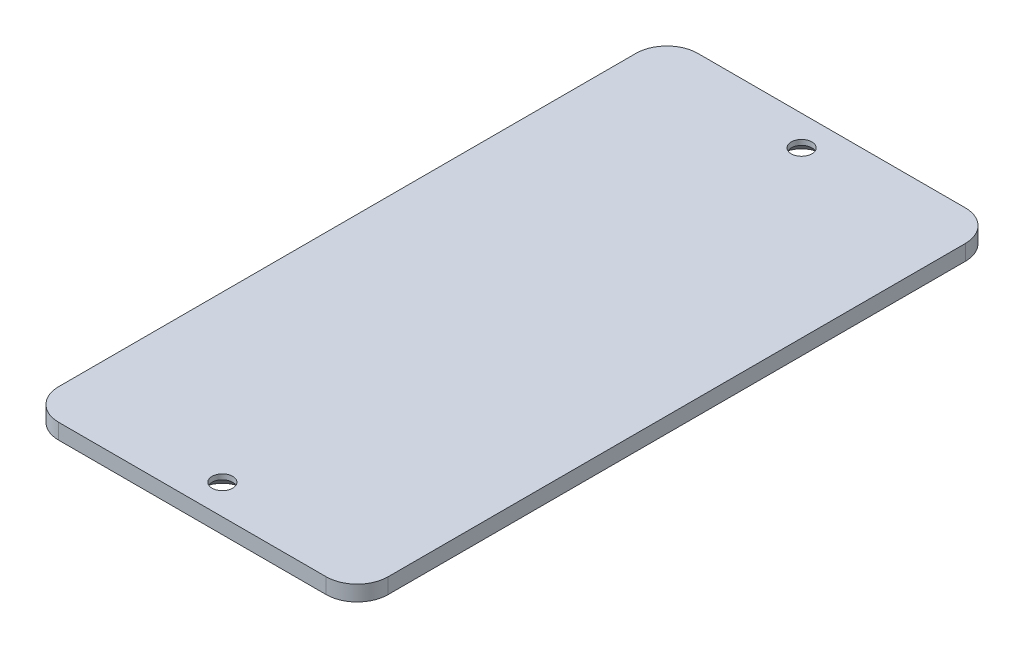
ISO-10303-21;
HEADER;
FILE_DESCRIPTION(('STEP AP214'),'2;1');
FILE_NAME('part.step','',(''),(''),'','','');
FILE_SCHEMA(('AUTOMOTIVE_DESIGN { 1 0 10303 214 1 1 1 1 }'));
ENDSEC;
DATA;
#1=APPLICATION_CONTEXT('core data for automotive mechanical design processes');
#2=APPLICATION_PROTOCOL_DEFINITION('international standard','automotive_design',2000,#1);
#3=PRODUCT_CONTEXT('',#1,'mechanical');
#4=PRODUCT('Part','Part','',(#3));
#5=PRODUCT_RELATED_PRODUCT_CATEGORY('part','',(#4));
#6=PRODUCT_DEFINITION_FORMATION('','',#4);
#7=PRODUCT_DEFINITION_CONTEXT('part definition',#1,'design');
#8=PRODUCT_DEFINITION('design','',#6,#7);
#9=PRODUCT_DEFINITION_SHAPE('','',#8);
#10=(LENGTH_UNIT() NAMED_UNIT(*) SI_UNIT(.MILLI.,.METRE.));
#11=(NAMED_UNIT(*) PLANE_ANGLE_UNIT() SI_UNIT($,.RADIAN.));
#12=(NAMED_UNIT(*) SI_UNIT($,.STERADIAN.) SOLID_ANGLE_UNIT());
#13=UNCERTAINTY_MEASURE_WITH_UNIT(LENGTH_MEASURE(1.E-05),#10,'distance_accuracy_value','');
#14=(GEOMETRIC_REPRESENTATION_CONTEXT(3) GLOBAL_UNCERTAINTY_ASSIGNED_CONTEXT((#13)) GLOBAL_UNIT_ASSIGNED_CONTEXT((#10,
#11,#12)) REPRESENTATION_CONTEXT('',''));
#15=CARTESIAN_POINT('',(0.,0.,0.));
#16=DIRECTION('',(0.,0.,1.));
#17=DIRECTION('',(1.,0.,0.));
#18=AXIS2_PLACEMENT_3D('',#15,#16,#17);
#19=CARTESIAN_POINT('',(0.,0.,-56.1));
#20=DIRECTION('',(0.,1.,0.));
#21=DIRECTION('',(0.,0.,1.));
#22=AXIS2_PLACEMENT_3D('',#19,#20,#21);
#23=CYLINDRICAL_SURFACE('',#22,2.);
#24=CARTESIAN_POINT('',(0.,3.,-56.1));
#25=DIRECTION('',(0.,-1.,0.));
#26=DIRECTION('',(0.,0.,-1.));
#27=AXIS2_PLACEMENT_3D('',#24,#25,#26);
#28=CIRCLE('',#27,2.);
#29=CARTESIAN_POINT('',(0.,3.,-58.1));
#30=VERTEX_POINT('',#29);
#31=EDGE_CURVE('E225',#30,#30,#28,.T.);
#32=ORIENTED_EDGE('',*,*,#31,.F.);
#33=EDGE_LOOP('',(#32));
#34=FACE_BOUND('',#33,.T.);
#35=CARTESIAN_POINT('',(0.,2.00000000000002,-56.1));
#36=DIRECTION('',(0.,-1.,0.));
#37=DIRECTION('',(0.,0.,-1.));
#38=AXIS2_PLACEMENT_3D('',#35,#36,#37);
#39=CIRCLE('',#38,1.99999999999999);
#40=CARTESIAN_POINT('',(0.,2.00000000000002,-58.1));
#41=VERTEX_POINT('',#40);
#42=EDGE_CURVE('E229',#41,#41,#39,.T.);
#43=ORIENTED_EDGE('',*,*,#42,.T.);
#44=EDGE_LOOP('',(#43));
#45=FACE_BOUND('',#44,.T.);
#46=ADVANCED_FACE('F46',(#34,#45),#23,.F.);
#47=CARTESIAN_POINT('',(0.,0.,0.));
#48=DIRECTION('',(0.,1.,0.));
#49=DIRECTION('',(0.,0.,1.));
#50=AXIS2_PLACEMENT_3D('',#47,#48,#49);
#51=PLANE('',#50);
#52=CARTESIAN_POINT('',(0.,0.,-56.1));
#53=DIRECTION('',(0.,-1.,0.));
#54=DIRECTION('',(0.,0.,-1.));
#55=AXIS2_PLACEMENT_3D('',#52,#53,#54);
#56=CIRCLE('',#55,4.);
#57=CARTESIAN_POINT('',(0.,0.,-60.1));
#58=VERTEX_POINT('',#57);
#59=EDGE_CURVE('E233',#58,#58,#56,.T.);
#60=ORIENTED_EDGE('',*,*,#59,.F.);
#61=EDGE_LOOP('',(#60));
#62=FACE_BOUND('',#61,.T.);
#63=DIRECTION('',(-1.,0.,0.));
#64=VECTOR('',#63,1.);
#65=CARTESIAN_POINT('',(-31.9,0.,-61.9));
#66=LINE('',#65,#64);
#67=CARTESIAN_POINT('',(25.9,0.,-61.9));
#68=VERTEX_POINT('',#67);
#69=CARTESIAN_POINT('',(-25.9,0.,-61.9));
#70=VERTEX_POINT('',#69);
#71=EDGE_CURVE('E131',#68,#70,#66,.T.);
#72=ORIENTED_EDGE('',*,*,#71,.F.);
#73=CARTESIAN_POINT('',(25.9,0.,-55.9));
#74=DIRECTION('',(0.,1.,0.));
#75=DIRECTION('',(0.,0.,1.));
#76=AXIS2_PLACEMENT_3D('',#73,#74,#75);
#77=CIRCLE('',#76,6.);
#78=CARTESIAN_POINT('',(31.9,0.,-55.9));
#79=VERTEX_POINT('',#78);
#80=EDGE_CURVE('E113',#68,#79,#77,.F.);
#81=ORIENTED_EDGE('',*,*,#80,.T.);
#82=DIRECTION('',(0.,0.,-1.));
#83=VECTOR('',#82,1.);
#84=CARTESIAN_POINT('',(31.9,0.,-61.9));
#85=LINE('',#84,#83);
#86=CARTESIAN_POINT('',(31.9,0.,55.9));
#87=VERTEX_POINT('',#86);
#88=EDGE_CURVE('E144',#87,#79,#85,.T.);
#89=ORIENTED_EDGE('',*,*,#88,.F.);
#90=CARTESIAN_POINT('',(25.9,0.,55.9));
#91=DIRECTION('',(0.,1.,0.));
#92=DIRECTION('',(0.,0.,1.));
#93=AXIS2_PLACEMENT_3D('',#90,#91,#92);
#94=CIRCLE('',#93,6.);
#95=CARTESIAN_POINT('',(25.9,0.,61.9));
#96=VERTEX_POINT('',#95);
#97=EDGE_CURVE('E125',#87,#96,#94,.F.);
#98=ORIENTED_EDGE('',*,*,#97,.T.);
#99=DIRECTION('',(1.,0.,0.));
#100=VECTOR('',#99,1.);
#101=CARTESIAN_POINT('',(-31.9,0.,61.9));
#102=LINE('',#101,#100);
#103=CARTESIAN_POINT('',(-25.9,0.,61.9));
#104=VERTEX_POINT('',#103);
#105=EDGE_CURVE('E149',#104,#96,#102,.T.);
#106=ORIENTED_EDGE('',*,*,#105,.F.);
#107=CARTESIAN_POINT('',(-25.9,0.,55.9));
#108=DIRECTION('',(0.,1.,0.));
#109=DIRECTION('',(0.,0.,1.));
#110=AXIS2_PLACEMENT_3D('',#107,#108,#109);
#111=CIRCLE('',#110,6.);
#112=CARTESIAN_POINT('',(-31.9,0.,55.9));
#113=VERTEX_POINT('',#112);
#114=EDGE_CURVE('E163',#104,#113,#111,.F.);
#115=ORIENTED_EDGE('',*,*,#114,.T.);
#116=DIRECTION('',(0.,0.,1.));
#117=VECTOR('',#116,1.);
#118=CARTESIAN_POINT('',(-31.9,0.,-61.9));
#119=LINE('',#118,#117);
#120=CARTESIAN_POINT('',(-31.9,0.,-55.9));
#121=VERTEX_POINT('',#120);
#122=EDGE_CURVE('E143',#121,#113,#119,.T.);
#123=ORIENTED_EDGE('',*,*,#122,.F.);
#124=CARTESIAN_POINT('',(-25.9,0.,-55.9));
#125=DIRECTION('',(0.,1.,0.));
#126=DIRECTION('',(0.,0.,1.));
#127=AXIS2_PLACEMENT_3D('',#124,#125,#126);
#128=CIRCLE('',#127,6.);
#129=EDGE_CURVE('E136',#121,#70,#128,.F.);
#130=ORIENTED_EDGE('',*,*,#129,.T.);
#131=EDGE_LOOP('',(#72,#81,#89,#98,#106,#115,#123,#130));
#132=FACE_BOUND('',#131,.T.);
#133=CARTESIAN_POINT('',(0.,0.,56.1));
#134=DIRECTION('',(0.,-1.,0.));
#135=DIRECTION('',(0.,0.,-1.));
#136=AXIS2_PLACEMENT_3D('',#133,#134,#135);
#137=CIRCLE('',#136,4.);
#138=CARTESIAN_POINT('',(0.,0.,52.1));
#139=VERTEX_POINT('',#138);
#140=EDGE_CURVE('E221',#139,#139,#137,.T.);
#141=ORIENTED_EDGE('',*,*,#140,.F.);
#142=EDGE_LOOP('',(#141));
#143=FACE_BOUND('',#142,.T.);
#144=ADVANCED_FACE('F139',(#62,#132,#143),#51,.F.);
#145=CARTESIAN_POINT('',(31.9,3.,-61.9));
#146=DIRECTION('',(-1.,0.,0.));
#147=DIRECTION('',(0.,0.,1.));
#148=AXIS2_PLACEMENT_3D('',#145,#146,#147);
#149=PLANE('',#148);
#150=ORIENTED_EDGE('',*,*,#88,.T.);
#151=DIRECTION('',(0.,-1.,0.));
#152=VECTOR('',#151,1.);
#153=CARTESIAN_POINT('',(31.9,3.,-55.9));
#154=LINE('',#153,#152);
#155=CARTESIAN_POINT('',(31.9,3.,-55.9));
#156=VERTEX_POINT('',#155);
#157=EDGE_CURVE('E118',#79,#156,#154,.F.);
#158=ORIENTED_EDGE('',*,*,#157,.T.);
#159=DIRECTION('',(0.,0.,-1.));
#160=VECTOR('',#159,1.);
#161=CARTESIAN_POINT('',(31.9,3.,-61.9));
#162=LINE('',#161,#160);
#163=CARTESIAN_POINT('',(31.9,3.,55.9));
#164=VERTEX_POINT('',#163);
#165=EDGE_CURVE('E157',#164,#156,#162,.T.);
#166=ORIENTED_EDGE('',*,*,#165,.F.);
#167=DIRECTION('',(0.,-1.,0.));
#168=VECTOR('',#167,1.);
#169=CARTESIAN_POINT('',(31.9,3.,55.9));
#170=LINE('',#169,#168);
#171=EDGE_CURVE('E124',#164,#87,#170,.T.);
#172=ORIENTED_EDGE('',*,*,#171,.T.);
#173=EDGE_LOOP('',(#150,#158,#166,#172));
#174=FACE_BOUND('',#173,.T.);
#175=ADVANCED_FACE('F241',(#174),#149,.F.);
#176=CARTESIAN_POINT('',(-31.9,3.,-61.9));
#177=DIRECTION('',(0.,0.,1.));
#178=DIRECTION('',(1.,0.,0.));
#179=AXIS2_PLACEMENT_3D('',#176,#177,#178);
#180=PLANE('',#179);
#181=DIRECTION('',(-1.,0.,0.));
#182=VECTOR('',#181,1.);
#183=CARTESIAN_POINT('',(-31.9,3.,-61.9));
#184=LINE('',#183,#182);
#185=CARTESIAN_POINT('',(25.9,3.,-61.9));
#186=VERTEX_POINT('',#185);
#187=CARTESIAN_POINT('',(-25.9,3.,-61.9));
#188=VERTEX_POINT('',#187);
#189=EDGE_CURVE('E134',#186,#188,#184,.T.);
#190=ORIENTED_EDGE('',*,*,#189,.F.);
#191=DIRECTION('',(0.,-1.,0.));
#192=VECTOR('',#191,1.);
#193=CARTESIAN_POINT('',(25.9,3.,-61.9));
#194=LINE('',#193,#192);
#195=EDGE_CURVE('E117',#186,#68,#194,.T.);
#196=ORIENTED_EDGE('',*,*,#195,.T.);
#197=ORIENTED_EDGE('',*,*,#71,.T.);
#198=DIRECTION('',(0.,-1.,0.));
#199=VECTOR('',#198,1.);
#200=CARTESIAN_POINT('',(-25.9,3.,-61.9));
#201=LINE('',#200,#199);
#202=EDGE_CURVE('E137',#70,#188,#201,.F.);
#203=ORIENTED_EDGE('',*,*,#202,.T.);
#204=EDGE_LOOP('',(#190,#196,#197,#203));
#205=FACE_BOUND('',#204,.T.);
#206=ADVANCED_FACE('F130',(#205),#180,.F.);
#207=CARTESIAN_POINT('',(-31.9,3.,-61.9));
#208=DIRECTION('',(1.,0.,0.));
#209=DIRECTION('',(0.,0.,-1.));
#210=AXIS2_PLACEMENT_3D('',#207,#208,#209);
#211=PLANE('',#210);
#212=ORIENTED_EDGE('',*,*,#122,.T.);
#213=DIRECTION('',(0.,-1.,0.));
#214=VECTOR('',#213,1.);
#215=CARTESIAN_POINT('',(-31.9,3.,55.9));
#216=LINE('',#215,#214);
#217=CARTESIAN_POINT('',(-31.9,3.,55.9));
#218=VERTEX_POINT('',#217);
#219=EDGE_CURVE('E11',#113,#218,#216,.F.);
#220=ORIENTED_EDGE('',*,*,#219,.T.);
#221=DIRECTION('',(0.,0.,1.));
#222=VECTOR('',#221,1.);
#223=CARTESIAN_POINT('',(-31.9,3.,-61.9));
#224=LINE('',#223,#222);
#225=CARTESIAN_POINT('',(-31.9,3.,-55.9));
#226=VERTEX_POINT('',#225);
#227=EDGE_CURVE('E196',#226,#218,#224,.T.);
#228=ORIENTED_EDGE('',*,*,#227,.F.);
#229=DIRECTION('',(0.,-1.,0.));
#230=VECTOR('',#229,1.);
#231=CARTESIAN_POINT('',(-31.9,3.,-55.9));
#232=LINE('',#231,#230);
#233=EDGE_CURVE('E55',#226,#121,#232,.T.);
#234=ORIENTED_EDGE('',*,*,#233,.T.);
#235=EDGE_LOOP('',(#212,#220,#228,#234));
#236=FACE_BOUND('',#235,.T.);
#237=ADVANCED_FACE('F194',(#236),#211,.F.);
#238=CARTESIAN_POINT('',(-31.9,3.,61.9));
#239=DIRECTION('',(0.,0.,-1.));
#240=DIRECTION('',(-1.,0.,0.));
#241=AXIS2_PLACEMENT_3D('',#238,#239,#240);
#242=PLANE('',#241);
#243=ORIENTED_EDGE('',*,*,#105,.T.);
#244=DIRECTION('',(0.,-1.,0.));
#245=VECTOR('',#244,1.);
#246=CARTESIAN_POINT('',(25.9,3.,61.9));
#247=LINE('',#246,#245);
#248=CARTESIAN_POINT('',(25.9,3.,61.9));
#249=VERTEX_POINT('',#248);
#250=EDGE_CURVE('E62',#96,#249,#247,.F.);
#251=ORIENTED_EDGE('',*,*,#250,.T.);
#252=DIRECTION('',(1.,0.,0.));
#253=VECTOR('',#252,1.);
#254=CARTESIAN_POINT('',(-31.9,3.,61.9));
#255=LINE('',#254,#253);
#256=CARTESIAN_POINT('',(-25.9,3.,61.9));
#257=VERTEX_POINT('',#256);
#258=EDGE_CURVE('E159',#257,#249,#255,.T.);
#259=ORIENTED_EDGE('',*,*,#258,.F.);
#260=DIRECTION('',(0.,-1.,0.));
#261=VECTOR('',#260,1.);
#262=CARTESIAN_POINT('',(-25.9,3.,61.9));
#263=LINE('',#262,#261);
#264=EDGE_CURVE('E184',#257,#104,#263,.T.);
#265=ORIENTED_EDGE('',*,*,#264,.T.);
#266=EDGE_LOOP('',(#243,#251,#259,#265));
#267=FACE_BOUND('',#266,.T.);
#268=ADVANCED_FACE('F203',(#267),#242,.F.);
#269=CARTESIAN_POINT('',(0.,3.,0.));
#270=DIRECTION('',(0.,1.,0.));
#271=DIRECTION('',(0.,0.,1.));
#272=AXIS2_PLACEMENT_3D('',#269,#270,#271);
#273=PLANE('',#272);
#274=ORIENTED_EDGE('',*,*,#31,.T.);
#275=EDGE_LOOP('',(#274));
#276=FACE_BOUND('',#275,.T.);
#277=CARTESIAN_POINT('',(0.,3.,56.1));
#278=DIRECTION('',(0.,1.,0.));
#279=DIRECTION('',(0.,0.,1.));
#280=AXIS2_PLACEMENT_3D('',#277,#278,#279);
#281=CIRCLE('',#280,2.);
#282=CARTESIAN_POINT('',(0.,3.,58.1));
#283=VERTEX_POINT('',#282);
#284=EDGE_CURVE('E151',#283,#283,#281,.T.);
#285=ORIENTED_EDGE('',*,*,#284,.F.);
#286=EDGE_LOOP('',(#285));
#287=FACE_BOUND('',#286,.T.);
#288=ORIENTED_EDGE('',*,*,#165,.T.);
#289=CARTESIAN_POINT('',(25.9,3.,-55.9));
#290=DIRECTION('',(0.,1.,0.));
#291=DIRECTION('',(0.,0.,1.));
#292=AXIS2_PLACEMENT_3D('',#289,#290,#291);
#293=CIRCLE('',#292,6.);
#294=EDGE_CURVE('E181',#156,#186,#293,.T.);
#295=ORIENTED_EDGE('',*,*,#294,.T.);
#296=ORIENTED_EDGE('',*,*,#189,.T.);
#297=CARTESIAN_POINT('',(-25.9,3.,-55.9));
#298=DIRECTION('',(0.,1.,0.));
#299=DIRECTION('',(0.,0.,1.));
#300=AXIS2_PLACEMENT_3D('',#297,#298,#299);
#301=CIRCLE('',#300,6.);
#302=EDGE_CURVE('E173',#188,#226,#301,.T.);
#303=ORIENTED_EDGE('',*,*,#302,.T.);
#304=ORIENTED_EDGE('',*,*,#227,.T.);
#305=CARTESIAN_POINT('',(-25.9,3.,55.9));
#306=DIRECTION('',(0.,1.,0.));
#307=DIRECTION('',(0.,0.,1.));
#308=AXIS2_PLACEMENT_3D('',#305,#306,#307);
#309=CIRCLE('',#308,6.);
#310=EDGE_CURVE('E69',#218,#257,#309,.T.);
#311=ORIENTED_EDGE('',*,*,#310,.T.);
#312=ORIENTED_EDGE('',*,*,#258,.T.);
#313=CARTESIAN_POINT('',(25.9,3.,55.9));
#314=DIRECTION('',(0.,1.,0.));
#315=DIRECTION('',(0.,0.,1.));
#316=AXIS2_PLACEMENT_3D('',#313,#314,#315);
#317=CIRCLE('',#316,6.);
#318=EDGE_CURVE('E178',#249,#164,#317,.T.);
#319=ORIENTED_EDGE('',*,*,#318,.T.);
#320=EDGE_LOOP('',(#288,#295,#296,#303,#304,#311,#312,#319));
#321=FACE_BOUND('',#320,.T.);
#322=ADVANCED_FACE('F254',(#276,#287,#321),#273,.T.);
#323=CARTESIAN_POINT('',(0.,0.,56.1));
#324=DIRECTION('',(0.,1.,0.));
#325=DIRECTION('',(0.,0.,1.));
#326=AXIS2_PLACEMENT_3D('',#323,#324,#325);
#327=CYLINDRICAL_SURFACE('',#326,2.);
#328=CARTESIAN_POINT('',(0.,2.00000000000002,56.1));
#329=DIRECTION('',(0.,-1.,0.));
#330=DIRECTION('',(0.,0.,-1.));
#331=AXIS2_PLACEMENT_3D('',#328,#329,#330);
#332=CIRCLE('',#331,1.99999999999999);
#333=CARTESIAN_POINT('',(0.,2.00000000000002,54.1));
#334=VERTEX_POINT('',#333);
#335=EDGE_CURVE('E217',#334,#334,#332,.T.);
#336=ORIENTED_EDGE('',*,*,#335,.T.);
#337=EDGE_LOOP('',(#336));
#338=FACE_BOUND('',#337,.T.);
#339=ORIENTED_EDGE('',*,*,#284,.T.);
#340=EDGE_LOOP('',(#339));
#341=FACE_BOUND('',#340,.T.);
#342=ADVANCED_FACE('F276',(#338,#341),#327,.F.);
#343=CARTESIAN_POINT('',(0.,0.,56.1));
#344=DIRECTION('',(0.,-1.,0.));
#345=DIRECTION('',(0.,0.,-1.));
#346=AXIS2_PLACEMENT_3D('',#343,#344,#345);
#347=CONICAL_SURFACE('',#346,4.,0.785398163397447);
#348=ORIENTED_EDGE('',*,*,#335,.F.);
#349=EDGE_LOOP('',(#348));
#350=FACE_BOUND('',#349,.T.);
#351=ORIENTED_EDGE('',*,*,#140,.T.);
#352=EDGE_LOOP('',(#351));
#353=FACE_BOUND('',#352,.T.);
#354=ADVANCED_FACE('F282',(#350,#353),#347,.F.);
#355=CARTESIAN_POINT('',(0.,0.,-56.1));
#356=DIRECTION('',(0.,-1.,0.));
#357=DIRECTION('',(0.,0.,-1.));
#358=AXIS2_PLACEMENT_3D('',#355,#356,#357);
#359=CONICAL_SURFACE('',#358,4.,0.785398163397447);
#360=ORIENTED_EDGE('',*,*,#42,.F.);
#361=EDGE_LOOP('',(#360));
#362=FACE_BOUND('',#361,.T.);
#363=ORIENTED_EDGE('',*,*,#59,.T.);
#364=EDGE_LOOP('',(#363));
#365=FACE_BOUND('',#364,.T.);
#366=ADVANCED_FACE('F238',(#362,#365),#359,.F.);
#367=CARTESIAN_POINT('',(25.9,3.,-55.9));
#368=DIRECTION('',(0.,-1.,0.));
#369=DIRECTION('',(0.,0.,-1.));
#370=AXIS2_PLACEMENT_3D('',#367,#368,#369);
#371=CYLINDRICAL_SURFACE('',#370,6.);
#372=ORIENTED_EDGE('',*,*,#294,.F.);
#373=ORIENTED_EDGE('',*,*,#157,.F.);
#374=ORIENTED_EDGE('',*,*,#80,.F.);
#375=ORIENTED_EDGE('',*,*,#195,.F.);
#376=EDGE_LOOP('',(#372,#373,#374,#375));
#377=FACE_BOUND('',#376,.T.);
#378=ADVANCED_FACE('F116',(#377),#371,.T.);
#379=CARTESIAN_POINT('',(25.9,3.,55.9));
#380=DIRECTION('',(0.,-1.,0.));
#381=DIRECTION('',(0.,0.,-1.));
#382=AXIS2_PLACEMENT_3D('',#379,#380,#381);
#383=CYLINDRICAL_SURFACE('',#382,6.);
#384=ORIENTED_EDGE('',*,*,#318,.F.);
#385=ORIENTED_EDGE('',*,*,#250,.F.);
#386=ORIENTED_EDGE('',*,*,#97,.F.);
#387=ORIENTED_EDGE('',*,*,#171,.F.);
#388=EDGE_LOOP('',(#384,#385,#386,#387));
#389=FACE_BOUND('',#388,.T.);
#390=ADVANCED_FACE('F264',(#389),#383,.T.);
#391=CARTESIAN_POINT('',(-25.9,3.,55.9));
#392=DIRECTION('',(0.,-1.,0.));
#393=DIRECTION('',(0.,0.,-1.));
#394=AXIS2_PLACEMENT_3D('',#391,#392,#393);
#395=CYLINDRICAL_SURFACE('',#394,6.);
#396=ORIENTED_EDGE('',*,*,#310,.F.);
#397=ORIENTED_EDGE('',*,*,#219,.F.);
#398=ORIENTED_EDGE('',*,*,#114,.F.);
#399=ORIENTED_EDGE('',*,*,#264,.F.);
#400=EDGE_LOOP('',(#396,#397,#398,#399));
#401=FACE_BOUND('',#400,.T.);
#402=ADVANCED_FACE('F202',(#401),#395,.T.);
#403=CARTESIAN_POINT('',(-25.9,3.,-55.9));
#404=DIRECTION('',(0.,-1.,0.));
#405=DIRECTION('',(0.,0.,-1.));
#406=AXIS2_PLACEMENT_3D('',#403,#404,#405);
#407=CYLINDRICAL_SURFACE('',#406,6.);
#408=ORIENTED_EDGE('',*,*,#302,.F.);
#409=ORIENTED_EDGE('',*,*,#202,.F.);
#410=ORIENTED_EDGE('',*,*,#129,.F.);
#411=ORIENTED_EDGE('',*,*,#233,.F.);
#412=EDGE_LOOP('',(#408,#409,#410,#411));
#413=FACE_BOUND('',#412,.T.);
#414=ADVANCED_FACE('F48',(#413),#407,.T.);
#415=CLOSED_SHELL('',(#46,#144,#175,#206,#237,#268,#322,#342,#354,#366,#378,#390,#402,#414));
#416=MANIFOLD_SOLID_BREP('B2',#415);
#417=ADVANCED_BREP_SHAPE_REPRESENTATION('',(#18,#416),#14);
#418=SHAPE_DEFINITION_REPRESENTATION(#9,#417);
ENDSEC;
END-ISO-10303-21;
